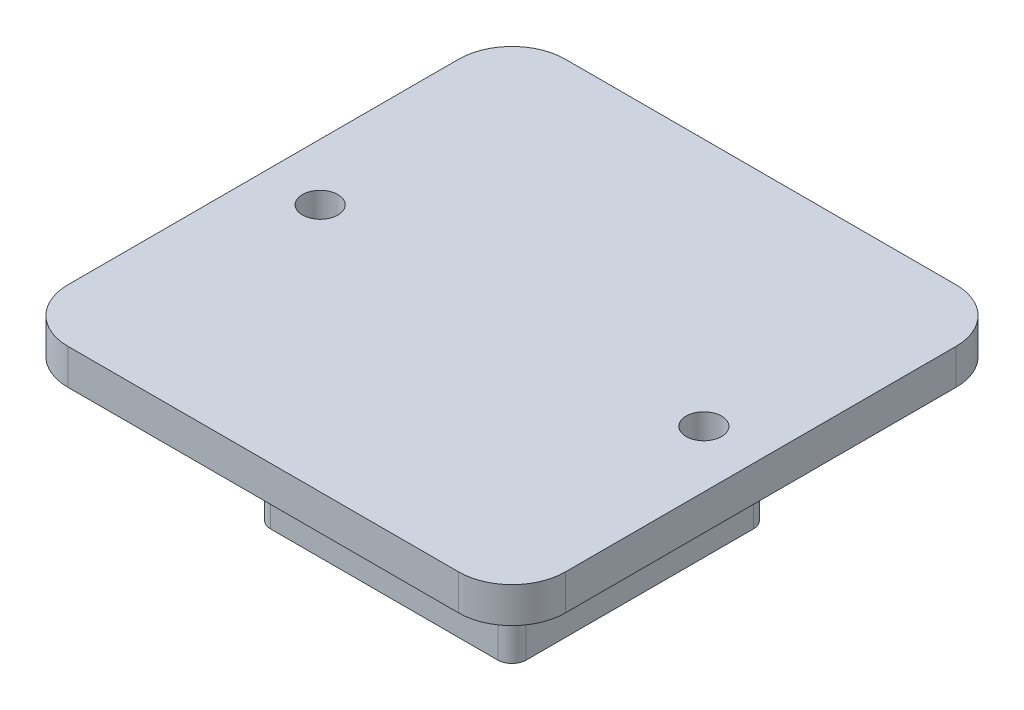
ISO-10303-21;
HEADER;
FILE_DESCRIPTION(('STEP AP214'),'2;1');
FILE_NAME('part.step','',(''),(''),'','','');
FILE_SCHEMA(('AUTOMOTIVE_DESIGN { 1 0 10303 214 1 1 1 1 }'));
ENDSEC;
DATA;
#1=APPLICATION_CONTEXT('core data for automotive mechanical design processes');
#2=APPLICATION_PROTOCOL_DEFINITION('international standard','automotive_design',2000,#1);
#3=PRODUCT_CONTEXT('',#1,'mechanical');
#4=PRODUCT('Part','Part','',(#3));
#5=PRODUCT_RELATED_PRODUCT_CATEGORY('part','',(#4));
#6=PRODUCT_DEFINITION_FORMATION('','',#4);
#7=PRODUCT_DEFINITION_CONTEXT('part definition',#1,'design');
#8=PRODUCT_DEFINITION('design','',#6,#7);
#9=PRODUCT_DEFINITION_SHAPE('','',#8);
#10=(LENGTH_UNIT() NAMED_UNIT(*) SI_UNIT(.MILLI.,.METRE.));
#11=(NAMED_UNIT(*) PLANE_ANGLE_UNIT() SI_UNIT($,.RADIAN.));
#12=(NAMED_UNIT(*) SI_UNIT($,.STERADIAN.) SOLID_ANGLE_UNIT());
#13=UNCERTAINTY_MEASURE_WITH_UNIT(LENGTH_MEASURE(1.E-05),#10,'distance_accuracy_value','');
#14=(GEOMETRIC_REPRESENTATION_CONTEXT(3) GLOBAL_UNCERTAINTY_ASSIGNED_CONTEXT((#13)) GLOBAL_UNIT_ASSIGNED_CONTEXT((#10,
#11,#12)) REPRESENTATION_CONTEXT('',''));
#15=CARTESIAN_POINT('',(0.,0.,0.));
#16=DIRECTION('',(0.,0.,1.));
#17=DIRECTION('',(1.,0.,0.));
#18=AXIS2_PLACEMENT_3D('',#15,#16,#17);
#19=CARTESIAN_POINT('',(0.,0.,0.));
#20=DIRECTION('',(0.,-1.,0.));
#21=DIRECTION('',(0.,0.,-1.));
#22=AXIS2_PLACEMENT_3D('',#19,#20,#21);
#23=PLANE('',#22);
#24=DIRECTION('',(-1.,0.,0.));
#25=VECTOR('',#24,1.);
#26=CARTESIAN_POINT('',(-18.,0.,-18.));
#27=LINE('',#26,#25);
#28=CARTESIAN_POINT('',(16.,0.,-18.));
#29=VERTEX_POINT('',#28);
#30=CARTESIAN_POINT('',(-16.,0.,-18.));
#31=VERTEX_POINT('',#30);
#32=EDGE_CURVE('E237',#29,#31,#27,.T.);
#33=ORIENTED_EDGE('',*,*,#32,.F.);
#34=CARTESIAN_POINT('',(16.,0.,-16.));
#35=DIRECTION('',(0.,-1.,0.));
#36=DIRECTION('',(0.,0.,-1.));
#37=AXIS2_PLACEMENT_3D('',#34,#35,#36);
#38=CIRCLE('',#37,2.);
#39=CARTESIAN_POINT('',(18.,0.,-16.));
#40=VERTEX_POINT('',#39);
#41=EDGE_CURVE('E332',#29,#40,#38,.T.);
#42=ORIENTED_EDGE('',*,*,#41,.T.);
#43=DIRECTION('',(0.,0.,-1.));
#44=VECTOR('',#43,1.);
#45=CARTESIAN_POINT('',(18.,0.,18.));
#46=LINE('',#45,#44);
#47=CARTESIAN_POINT('',(18.,0.,16.));
#48=VERTEX_POINT('',#47);
#49=EDGE_CURVE('E231',#48,#40,#46,.T.);
#50=ORIENTED_EDGE('',*,*,#49,.F.);
#51=CARTESIAN_POINT('',(16.,0.,16.));
#52=DIRECTION('',(0.,-1.,0.));
#53=DIRECTION('',(0.,0.,-1.));
#54=AXIS2_PLACEMENT_3D('',#51,#52,#53);
#55=CIRCLE('',#54,2.);
#56=CARTESIAN_POINT('',(16.,0.,18.));
#57=VERTEX_POINT('',#56);
#58=EDGE_CURVE('E329',#48,#57,#55,.T.);
#59=ORIENTED_EDGE('',*,*,#58,.T.);
#60=DIRECTION('',(1.,0.,0.));
#61=VECTOR('',#60,1.);
#62=CARTESIAN_POINT('',(-18.,0.,18.));
#63=LINE('',#62,#61);
#64=CARTESIAN_POINT('',(-16.,0.,18.));
#65=VERTEX_POINT('',#64);
#66=EDGE_CURVE('E250',#65,#57,#63,.T.);
#67=ORIENTED_EDGE('',*,*,#66,.F.);
#68=CARTESIAN_POINT('',(-16.,0.,16.));
#69=DIRECTION('',(0.,-1.,0.));
#70=DIRECTION('',(0.,0.,-1.));
#71=AXIS2_PLACEMENT_3D('',#68,#69,#70);
#72=CIRCLE('',#71,2.);
#73=CARTESIAN_POINT('',(-18.,0.,16.));
#74=VERTEX_POINT('',#73);
#75=EDGE_CURVE('E323',#65,#74,#72,.T.);
#76=ORIENTED_EDGE('',*,*,#75,.T.);
#77=DIRECTION('',(0.,0.,1.));
#78=VECTOR('',#77,1.);
#79=CARTESIAN_POINT('',(-18.,0.,18.));
#80=LINE('',#79,#78);
#81=CARTESIAN_POINT('',(-18.,0.,-16.));
#82=VERTEX_POINT('',#81);
#83=EDGE_CURVE('E246',#82,#74,#80,.T.);
#84=ORIENTED_EDGE('',*,*,#83,.F.);
#85=CARTESIAN_POINT('',(-16.,0.,-16.));
#86=DIRECTION('',(0.,-1.,0.));
#87=DIRECTION('',(0.,0.,-1.));
#88=AXIS2_PLACEMENT_3D('',#85,#86,#87);
#89=CIRCLE('',#88,2.);
#90=EDGE_CURVE('E326',#82,#31,#89,.T.);
#91=ORIENTED_EDGE('',*,*,#90,.T.);
#92=EDGE_LOOP('',(#33,#42,#50,#59,#67,#76,#84,#91));
#93=FACE_BOUND('',#92,.T.);
#94=DIRECTION('',(1.,0.,0.));
#95=VECTOR('',#94,1.);
#96=CARTESIAN_POINT('',(-15.01,0.,15.01));
#97=LINE('',#96,#95);
#98=CARTESIAN_POINT('',(-15.01,0.,15.01));
#99=VERTEX_POINT('',#98);
#100=CARTESIAN_POINT('',(15.01,0.,15.01));
#101=VERTEX_POINT('',#100);
#102=EDGE_CURVE('E225',#99,#101,#97,.T.);
#103=ORIENTED_EDGE('',*,*,#102,.T.);
#104=DIRECTION('',(0.,0.,-1.));
#105=VECTOR('',#104,1.);
#106=CARTESIAN_POINT('',(15.01,0.,15.01));
#107=LINE('',#106,#105);
#108=CARTESIAN_POINT('',(15.01,0.,-15.01));
#109=VERTEX_POINT('',#108);
#110=EDGE_CURVE('E459',#101,#109,#107,.T.);
#111=ORIENTED_EDGE('',*,*,#110,.T.);
#112=DIRECTION('',(-1.,0.,0.));
#113=VECTOR('',#112,1.);
#114=CARTESIAN_POINT('',(-15.01,0.,-15.01));
#115=LINE('',#114,#113);
#116=CARTESIAN_POINT('',(-15.01,0.,-15.01));
#117=VERTEX_POINT('',#116);
#118=EDGE_CURVE('E229',#109,#117,#115,.T.);
#119=ORIENTED_EDGE('',*,*,#118,.T.);
#120=DIRECTION('',(0.,0.,1.));
#121=VECTOR('',#120,1.);
#122=CARTESIAN_POINT('',(-15.01,0.,15.01));
#123=LINE('',#122,#121);
#124=EDGE_CURVE('E483',#117,#99,#123,.T.);
#125=ORIENTED_EDGE('',*,*,#124,.T.);
#126=EDGE_LOOP('',(#103,#111,#119,#125));
#127=FACE_BOUND('',#126,.T.);
#128=ADVANCED_FACE('F41',(#93,#127),#23,.T.);
#129=CARTESIAN_POINT('',(18.,20.,18.));
#130=DIRECTION('',(-1.,0.,0.));
#131=DIRECTION('',(0.,0.,1.));
#132=AXIS2_PLACEMENT_3D('',#129,#130,#131);
#133=PLANE('',#132);
#134=DIRECTION('',(0.,-1.,0.));
#135=VECTOR('',#134,1.);
#136=CARTESIAN_POINT('',(18.,20.,-16.));
#137=LINE('',#136,#135);
#138=CARTESIAN_POINT('',(18.,15.,-16.));
#139=VERTEX_POINT('',#138);
#140=EDGE_CURVE('E338',#40,#139,#137,.F.);
#141=ORIENTED_EDGE('',*,*,#140,.T.);
#142=DIRECTION('',(0.,0.,-1.));
#143=VECTOR('',#142,1.);
#144=CARTESIAN_POINT('',(18.,15.,18.));
#145=LINE('',#144,#143);
#146=CARTESIAN_POINT('',(18.,15.,16.));
#147=VERTEX_POINT('',#146);
#148=EDGE_CURVE('E66',#139,#147,#145,.F.);
#149=ORIENTED_EDGE('',*,*,#148,.T.);
#150=DIRECTION('',(0.,-1.,0.));
#151=VECTOR('',#150,1.);
#152=CARTESIAN_POINT('',(18.,20.,16.));
#153=LINE('',#152,#151);
#154=EDGE_CURVE('E335',#147,#48,#153,.T.);
#155=ORIENTED_EDGE('',*,*,#154,.T.);
#156=ORIENTED_EDGE('',*,*,#49,.T.);
#157=EDGE_LOOP('',(#141,#149,#155,#156));
#158=FACE_BOUND('',#157,.T.);
#159=ADVANCED_FACE('F501',(#158),#133,.F.);
#160=CARTESIAN_POINT('',(-18.,20.,-18.));
#161=DIRECTION('',(0.,0.,1.));
#162=DIRECTION('',(1.,0.,0.));
#163=AXIS2_PLACEMENT_3D('',#160,#161,#162);
#164=PLANE('',#163);
#165=DIRECTION('',(0.,-1.,0.));
#166=VECTOR('',#165,1.);
#167=CARTESIAN_POINT('',(-16.,20.,-18.));
#168=LINE('',#167,#166);
#169=CARTESIAN_POINT('',(-16.,15.,-18.));
#170=VERTEX_POINT('',#169);
#171=EDGE_CURVE('E306',#31,#170,#168,.F.);
#172=ORIENTED_EDGE('',*,*,#171,.T.);
#173=DIRECTION('',(-1.,0.,0.));
#174=VECTOR('',#173,1.);
#175=CARTESIAN_POINT('',(-18.,15.,-18.));
#176=LINE('',#175,#174);
#177=CARTESIAN_POINT('',(16.,15.,-18.));
#178=VERTEX_POINT('',#177);
#179=EDGE_CURVE('E389',#170,#178,#176,.F.);
#180=ORIENTED_EDGE('',*,*,#179,.T.);
#181=DIRECTION('',(0.,-1.,0.));
#182=VECTOR('',#181,1.);
#183=CARTESIAN_POINT('',(16.,20.,-18.));
#184=LINE('',#183,#182);
#185=EDGE_CURVE('E320',#178,#29,#184,.T.);
#186=ORIENTED_EDGE('',*,*,#185,.T.);
#187=ORIENTED_EDGE('',*,*,#32,.T.);
#188=EDGE_LOOP('',(#172,#180,#186,#187));
#189=FACE_BOUND('',#188,.T.);
#190=ADVANCED_FACE('F507',(#189),#164,.F.);
#191=CARTESIAN_POINT('',(-18.,20.,18.));
#192=DIRECTION('',(1.,0.,0.));
#193=DIRECTION('',(0.,0.,-1.));
#194=AXIS2_PLACEMENT_3D('',#191,#192,#193);
#195=PLANE('',#194);
#196=DIRECTION('',(0.,-1.,0.));
#197=VECTOR('',#196,1.);
#198=CARTESIAN_POINT('',(-18.,20.,16.));
#199=LINE('',#198,#197);
#200=CARTESIAN_POINT('',(-18.,15.,16.));
#201=VERTEX_POINT('',#200);
#202=EDGE_CURVE('E347',#74,#201,#199,.F.);
#203=ORIENTED_EDGE('',*,*,#202,.T.);
#204=DIRECTION('',(0.,0.,1.));
#205=VECTOR('',#204,1.);
#206=CARTESIAN_POINT('',(-18.,15.,18.));
#207=LINE('',#206,#205);
#208=CARTESIAN_POINT('',(-18.,15.,-16.));
#209=VERTEX_POINT('',#208);
#210=EDGE_CURVE('E383',#201,#209,#207,.F.);
#211=ORIENTED_EDGE('',*,*,#210,.T.);
#212=DIRECTION('',(0.,-1.,0.));
#213=VECTOR('',#212,1.);
#214=CARTESIAN_POINT('',(-18.,20.,-16.));
#215=LINE('',#214,#213);
#216=EDGE_CURVE('E351',#209,#82,#215,.T.);
#217=ORIENTED_EDGE('',*,*,#216,.T.);
#218=ORIENTED_EDGE('',*,*,#83,.T.);
#219=EDGE_LOOP('',(#203,#211,#217,#218));
#220=FACE_BOUND('',#219,.T.);
#221=ADVANCED_FACE('F516',(#220),#195,.F.);
#222=CARTESIAN_POINT('',(-18.,20.,18.));
#223=DIRECTION('',(0.,0.,-1.));
#224=DIRECTION('',(-1.,0.,0.));
#225=AXIS2_PLACEMENT_3D('',#222,#223,#224);
#226=PLANE('',#225);
#227=DIRECTION('',(0.,-1.,0.));
#228=VECTOR('',#227,1.);
#229=CARTESIAN_POINT('',(16.,20.,18.));
#230=LINE('',#229,#228);
#231=CARTESIAN_POINT('',(16.,15.,18.));
#232=VERTEX_POINT('',#231);
#233=EDGE_CURVE('E344',#57,#232,#230,.F.);
#234=ORIENTED_EDGE('',*,*,#233,.T.);
#235=DIRECTION('',(1.,0.,0.));
#236=VECTOR('',#235,1.);
#237=CARTESIAN_POINT('',(-18.,15.,18.));
#238=LINE('',#237,#236);
#239=CARTESIAN_POINT('',(-16.,15.,18.));
#240=VERTEX_POINT('',#239);
#241=EDGE_CURVE('E11',#232,#240,#238,.F.);
#242=ORIENTED_EDGE('',*,*,#241,.T.);
#243=DIRECTION('',(0.,-1.,0.));
#244=VECTOR('',#243,1.);
#245=CARTESIAN_POINT('',(-16.,20.,18.));
#246=LINE('',#245,#244);
#247=EDGE_CURVE('E341',#240,#65,#246,.T.);
#248=ORIENTED_EDGE('',*,*,#247,.T.);
#249=ORIENTED_EDGE('',*,*,#66,.T.);
#250=EDGE_LOOP('',(#234,#242,#248,#249));
#251=FACE_BOUND('',#250,.T.);
#252=ADVANCED_FACE('F513',(#251),#226,.F.);
#253=CARTESIAN_POINT('',(15.01,20.,15.01));
#254=DIRECTION('',(-1.,0.,0.));
#255=DIRECTION('',(0.,0.,1.));
#256=AXIS2_PLACEMENT_3D('',#253,#254,#255);
#257=PLANE('',#256);
#258=ORIENTED_EDGE('',*,*,#110,.F.);
#259=DIRECTION('',(0.,-1.,0.));
#260=VECTOR('',#259,1.);
#261=CARTESIAN_POINT('',(15.01,20.,15.01));
#262=LINE('',#261,#260);
#263=CARTESIAN_POINT('',(15.01,20.,15.01));
#264=VERTEX_POINT('',#263);
#265=EDGE_CURVE('E223',#264,#101,#262,.T.);
#266=ORIENTED_EDGE('',*,*,#265,.F.);
#267=DIRECTION('',(0.,0.,-1.));
#268=VECTOR('',#267,1.);
#269=CARTESIAN_POINT('',(15.01,20.,15.01));
#270=LINE('',#269,#268);
#271=CARTESIAN_POINT('',(15.01,20.,-15.01));
#272=VERTEX_POINT('',#271);
#273=EDGE_CURVE('E207',#264,#272,#270,.T.);
#274=ORIENTED_EDGE('',*,*,#273,.T.);
#275=DIRECTION('',(0.,-1.,0.));
#276=VECTOR('',#275,1.);
#277=CARTESIAN_POINT('',(15.01,20.,-15.01));
#278=LINE('',#277,#276);
#279=EDGE_CURVE('E220',#272,#109,#278,.T.);
#280=ORIENTED_EDGE('',*,*,#279,.T.);
#281=EDGE_LOOP('',(#258,#266,#274,#280));
#282=FACE_BOUND('',#281,.T.);
#283=ADVANCED_FACE('F219',(#282),#257,.T.);
#284=CARTESIAN_POINT('',(-15.01,20.,-15.01));
#285=DIRECTION('',(0.,0.,1.));
#286=DIRECTION('',(1.,0.,0.));
#287=AXIS2_PLACEMENT_3D('',#284,#285,#286);
#288=PLANE('',#287);
#289=ORIENTED_EDGE('',*,*,#118,.F.);
#290=ORIENTED_EDGE('',*,*,#279,.F.);
#291=DIRECTION('',(-1.,0.,0.));
#292=VECTOR('',#291,1.);
#293=CARTESIAN_POINT('',(-15.01,20.,-15.01));
#294=LINE('',#293,#292);
#295=CARTESIAN_POINT('',(-15.01,20.,-15.01));
#296=VERTEX_POINT('',#295);
#297=EDGE_CURVE('E204',#272,#296,#294,.T.);
#298=ORIENTED_EDGE('',*,*,#297,.T.);
#299=DIRECTION('',(0.,-1.,0.));
#300=VECTOR('',#299,1.);
#301=CARTESIAN_POINT('',(-15.01,20.,-15.01));
#302=LINE('',#301,#300);
#303=EDGE_CURVE('E232',#296,#117,#302,.T.);
#304=ORIENTED_EDGE('',*,*,#303,.T.);
#305=EDGE_LOOP('',(#289,#290,#298,#304));
#306=FACE_BOUND('',#305,.T.);
#307=ADVANCED_FACE('F227',(#306),#288,.T.);
#308=CARTESIAN_POINT('',(-15.01,20.,15.01));
#309=DIRECTION('',(1.,0.,0.));
#310=DIRECTION('',(0.,0.,-1.));
#311=AXIS2_PLACEMENT_3D('',#308,#309,#310);
#312=PLANE('',#311);
#313=ORIENTED_EDGE('',*,*,#124,.F.);
#314=ORIENTED_EDGE('',*,*,#303,.F.);
#315=DIRECTION('',(0.,0.,1.));
#316=VECTOR('',#315,1.);
#317=CARTESIAN_POINT('',(-15.01,20.,15.01));
#318=LINE('',#317,#316);
#319=CARTESIAN_POINT('',(-15.01,20.,15.01));
#320=VERTEX_POINT('',#319);
#321=EDGE_CURVE('E210',#296,#320,#318,.T.);
#322=ORIENTED_EDGE('',*,*,#321,.T.);
#323=DIRECTION('',(0.,-1.,0.));
#324=VECTOR('',#323,1.);
#325=CARTESIAN_POINT('',(-15.01,20.,15.01));
#326=LINE('',#325,#324);
#327=EDGE_CURVE('E239',#320,#99,#326,.T.);
#328=ORIENTED_EDGE('',*,*,#327,.T.);
#329=EDGE_LOOP('',(#313,#314,#322,#328));
#330=FACE_BOUND('',#329,.T.);
#331=ADVANCED_FACE('F496',(#330),#312,.T.);
#332=CARTESIAN_POINT('',(-15.01,20.,15.01));
#333=DIRECTION('',(0.,0.,-1.));
#334=DIRECTION('',(-1.,0.,0.));
#335=AXIS2_PLACEMENT_3D('',#332,#333,#334);
#336=PLANE('',#335);
#337=ORIENTED_EDGE('',*,*,#102,.F.);
#338=ORIENTED_EDGE('',*,*,#327,.F.);
#339=DIRECTION('',(1.,0.,0.));
#340=VECTOR('',#339,1.);
#341=CARTESIAN_POINT('',(-15.01,20.,15.01));
#342=LINE('',#341,#340);
#343=EDGE_CURVE('E476',#320,#264,#342,.T.);
#344=ORIENTED_EDGE('',*,*,#343,.T.);
#345=ORIENTED_EDGE('',*,*,#265,.T.);
#346=EDGE_LOOP('',(#337,#338,#344,#345));
#347=FACE_BOUND('',#346,.T.);
#348=ADVANCED_FACE('F498',(#347),#336,.T.);
#349=CARTESIAN_POINT('',(0.,20.,0.));
#350=DIRECTION('',(0.,-1.,0.));
#351=DIRECTION('',(0.,0.,-1.));
#352=AXIS2_PLACEMENT_3D('',#349,#350,#351);
#353=PLANE('',#352);
#354=ORIENTED_EDGE('',*,*,#273,.F.);
#355=ORIENTED_EDGE('',*,*,#343,.F.);
#356=ORIENTED_EDGE('',*,*,#321,.F.);
#357=ORIENTED_EDGE('',*,*,#297,.F.);
#358=EDGE_LOOP('',(#354,#355,#356,#357));
#359=FACE_BOUND('',#358,.T.);
#360=ADVANCED_FACE('F206',(#359),#353,.T.);
#361=CARTESIAN_POINT('',(35.,25.,35.));
#362=DIRECTION('',(-1.,0.,0.));
#363=DIRECTION('',(0.,0.,1.));
#364=AXIS2_PLACEMENT_3D('',#361,#362,#363);
#365=PLANE('',#364);
#366=DIRECTION('',(0.,0.,-1.));
#367=VECTOR('',#366,1.);
#368=CARTESIAN_POINT('',(35.,20.,35.));
#369=LINE('',#368,#367);
#370=CARTESIAN_POINT('',(35.,20.,27.5));
#371=VERTEX_POINT('',#370);
#372=CARTESIAN_POINT('',(35.,20.,-27.5));
#373=VERTEX_POINT('',#372);
#374=EDGE_CURVE('E316',#371,#373,#369,.T.);
#375=ORIENTED_EDGE('',*,*,#374,.T.);
#376=DIRECTION('',(0.,-1.,0.));
#377=VECTOR('',#376,1.);
#378=CARTESIAN_POINT('',(35.,25.,-27.5));
#379=LINE('',#378,#377);
#380=CARTESIAN_POINT('',(35.,25.,-27.5));
#381=VERTEX_POINT('',#380);
#382=EDGE_CURVE('E277',#373,#381,#379,.F.);
#383=ORIENTED_EDGE('',*,*,#382,.T.);
#384=DIRECTION('',(0.,0.,-1.));
#385=VECTOR('',#384,1.);
#386=CARTESIAN_POINT('',(35.,25.,35.));
#387=LINE('',#386,#385);
#388=CARTESIAN_POINT('',(35.,25.,27.5));
#389=VERTEX_POINT('',#388);
#390=EDGE_CURVE('E442',#389,#381,#387,.T.);
#391=ORIENTED_EDGE('',*,*,#390,.F.);
#392=DIRECTION('',(0.,-1.,0.));
#393=VECTOR('',#392,1.);
#394=CARTESIAN_POINT('',(35.,25.,27.5));
#395=LINE('',#394,#393);
#396=EDGE_CURVE('E273',#389,#371,#395,.T.);
#397=ORIENTED_EDGE('',*,*,#396,.T.);
#398=EDGE_LOOP('',(#375,#383,#391,#397));
#399=FACE_BOUND('',#398,.T.);
#400=ADVANCED_FACE('F654',(#399),#365,.F.);
#401=CARTESIAN_POINT('',(-35.,25.,-35.));
#402=DIRECTION('',(0.,0.,1.));
#403=DIRECTION('',(1.,0.,0.));
#404=AXIS2_PLACEMENT_3D('',#401,#402,#403);
#405=PLANE('',#404);
#406=DIRECTION('',(-1.,0.,0.));
#407=VECTOR('',#406,1.);
#408=CARTESIAN_POINT('',(-35.,25.,-35.));
#409=LINE('',#408,#407);
#410=CARTESIAN_POINT('',(27.5,25.,-35.));
#411=VERTEX_POINT('',#410);
#412=CARTESIAN_POINT('',(-27.5,25.,-35.));
#413=VERTEX_POINT('',#412);
#414=EDGE_CURVE('E446',#411,#413,#409,.T.);
#415=ORIENTED_EDGE('',*,*,#414,.F.);
#416=DIRECTION('',(0.,-1.,0.));
#417=VECTOR('',#416,1.);
#418=CARTESIAN_POINT('',(27.5,25.,-35.));
#419=LINE('',#418,#417);
#420=CARTESIAN_POINT('',(27.5,20.,-35.));
#421=VERTEX_POINT('',#420);
#422=EDGE_CURVE('E257',#411,#421,#419,.T.);
#423=ORIENTED_EDGE('',*,*,#422,.T.);
#424=DIRECTION('',(-1.,0.,0.));
#425=VECTOR('',#424,1.);
#426=CARTESIAN_POINT('',(-35.,20.,-35.));
#427=LINE('',#426,#425);
#428=CARTESIAN_POINT('',(-27.5,20.,-35.));
#429=VERTEX_POINT('',#428);
#430=EDGE_CURVE('E463',#421,#429,#427,.T.);
#431=ORIENTED_EDGE('',*,*,#430,.T.);
#432=DIRECTION('',(0.,-1.,0.));
#433=VECTOR('',#432,1.);
#434=CARTESIAN_POINT('',(-27.5,25.,-35.));
#435=LINE('',#434,#433);
#436=EDGE_CURVE('E254',#429,#413,#435,.F.);
#437=ORIENTED_EDGE('',*,*,#436,.T.);
#438=EDGE_LOOP('',(#415,#423,#431,#437));
#439=FACE_BOUND('',#438,.T.);
#440=ADVANCED_FACE('F633',(#439),#405,.F.);
#441=CARTESIAN_POINT('',(-35.,25.,35.));
#442=DIRECTION('',(1.,0.,0.));
#443=DIRECTION('',(0.,0.,-1.));
#444=AXIS2_PLACEMENT_3D('',#441,#442,#443);
#445=PLANE('',#444);
#446=DIRECTION('',(0.,0.,1.));
#447=VECTOR('',#446,1.);
#448=CARTESIAN_POINT('',(-35.,20.,35.));
#449=LINE('',#448,#447);
#450=CARTESIAN_POINT('',(-35.,20.,-27.5));
#451=VERTEX_POINT('',#450);
#452=CARTESIAN_POINT('',(-35.,20.,27.5));
#453=VERTEX_POINT('',#452);
#454=EDGE_CURVE('E467',#451,#453,#449,.T.);
#455=ORIENTED_EDGE('',*,*,#454,.T.);
#456=DIRECTION('',(0.,-1.,0.));
#457=VECTOR('',#456,1.);
#458=CARTESIAN_POINT('',(-35.,25.,27.5));
#459=LINE('',#458,#457);
#460=CARTESIAN_POINT('',(-35.,25.,27.5));
#461=VERTEX_POINT('',#460);
#462=EDGE_CURVE('E303',#453,#461,#459,.F.);
#463=ORIENTED_EDGE('',*,*,#462,.T.);
#464=DIRECTION('',(0.,0.,1.));
#465=VECTOR('',#464,1.);
#466=CARTESIAN_POINT('',(-35.,25.,35.));
#467=LINE('',#466,#465);
#468=CARTESIAN_POINT('',(-35.,25.,-27.5));
#469=VERTEX_POINT('',#468);
#470=EDGE_CURVE('E451',#469,#461,#467,.T.);
#471=ORIENTED_EDGE('',*,*,#470,.F.);
#472=DIRECTION('',(0.,-1.,0.));
#473=VECTOR('',#472,1.);
#474=CARTESIAN_POINT('',(-35.,25.,-27.5));
#475=LINE('',#474,#473);
#476=EDGE_CURVE('E299',#469,#451,#475,.T.);
#477=ORIENTED_EDGE('',*,*,#476,.T.);
#478=EDGE_LOOP('',(#455,#463,#471,#477));
#479=FACE_BOUND('',#478,.T.);
#480=ADVANCED_FACE('F641',(#479),#445,.F.);
#481=CARTESIAN_POINT('',(-35.,25.,35.));
#482=DIRECTION('',(0.,0.,-1.));
#483=DIRECTION('',(-1.,0.,0.));
#484=AXIS2_PLACEMENT_3D('',#481,#482,#483);
#485=PLANE('',#484);
#486=DIRECTION('',(1.,0.,0.));
#487=VECTOR('',#486,1.);
#488=CARTESIAN_POINT('',(-35.,20.,35.));
#489=LINE('',#488,#487);
#490=CARTESIAN_POINT('',(-27.5,20.,35.));
#491=VERTEX_POINT('',#490);
#492=CARTESIAN_POINT('',(27.5,20.,35.));
#493=VERTEX_POINT('',#492);
#494=EDGE_CURVE('E447',#491,#493,#489,.T.);
#495=ORIENTED_EDGE('',*,*,#494,.T.);
#496=DIRECTION('',(0.,-1.,0.));
#497=VECTOR('',#496,1.);
#498=CARTESIAN_POINT('',(27.5,25.,35.));
#499=LINE('',#498,#497);
#500=CARTESIAN_POINT('',(27.5,25.,35.));
#501=VERTEX_POINT('',#500);
#502=EDGE_CURVE('E296',#493,#501,#499,.F.);
#503=ORIENTED_EDGE('',*,*,#502,.T.);
#504=DIRECTION('',(1.,0.,0.));
#505=VECTOR('',#504,1.);
#506=CARTESIAN_POINT('',(-35.,25.,35.));
#507=LINE('',#506,#505);
#508=CARTESIAN_POINT('',(-27.5,25.,35.));
#509=VERTEX_POINT('',#508);
#510=EDGE_CURVE('E455',#509,#501,#507,.T.);
#511=ORIENTED_EDGE('',*,*,#510,.F.);
#512=DIRECTION('',(0.,-1.,0.));
#513=VECTOR('',#512,1.);
#514=CARTESIAN_POINT('',(-27.5,25.,35.));
#515=LINE('',#514,#513);
#516=EDGE_CURVE('E292',#509,#491,#515,.T.);
#517=ORIENTED_EDGE('',*,*,#516,.T.);
#518=EDGE_LOOP('',(#495,#503,#511,#517));
#519=FACE_BOUND('',#518,.T.);
#520=ADVANCED_FACE('F647',(#519),#485,.F.);
#521=CARTESIAN_POINT('',(0.,25.,0.));
#522=DIRECTION('',(0.,-1.,0.));
#523=DIRECTION('',(0.,0.,-1.));
#524=AXIS2_PLACEMENT_3D('',#521,#522,#523);
#525=PLANE('',#524);
#526=CARTESIAN_POINT('',(-27.,25.,0.));
#527=DIRECTION('',(0.,1.,0.));
#528=DIRECTION('',(0.,0.,1.));
#529=AXIS2_PLACEMENT_3D('',#526,#527,#528);
#530=CIRCLE('',#529,2.5);
#531=CARTESIAN_POINT('',(-27.,25.,2.5));
#532=VERTEX_POINT('',#531);
#533=EDGE_CURVE('E312',#532,#532,#530,.T.);
#534=ORIENTED_EDGE('',*,*,#533,.F.);
#535=EDGE_LOOP('',(#534));
#536=FACE_BOUND('',#535,.T.);
#537=CARTESIAN_POINT('',(27.,25.,0.));
#538=DIRECTION('',(0.,1.,0.));
#539=DIRECTION('',(0.,0.,1.));
#540=AXIS2_PLACEMENT_3D('',#537,#538,#539);
#541=CIRCLE('',#540,2.5);
#542=CARTESIAN_POINT('',(27.,25.,2.49999999999999));
#543=VERTEX_POINT('',#542);
#544=EDGE_CURVE('E428',#543,#543,#541,.T.);
#545=ORIENTED_EDGE('',*,*,#544,.F.);
#546=EDGE_LOOP('',(#545));
#547=FACE_BOUND('',#546,.T.);
#548=ORIENTED_EDGE('',*,*,#390,.T.);
#549=CARTESIAN_POINT('',(27.5,25.,-27.5));
#550=DIRECTION('',(0.,-1.,0.));
#551=DIRECTION('',(0.,0.,-1.));
#552=AXIS2_PLACEMENT_3D('',#549,#550,#551);
#553=CIRCLE('',#552,7.5);
#554=EDGE_CURVE('E289',#381,#411,#553,.F.);
#555=ORIENTED_EDGE('',*,*,#554,.T.);
#556=ORIENTED_EDGE('',*,*,#414,.T.);
#557=CARTESIAN_POINT('',(-27.5,25.,-27.5));
#558=DIRECTION('',(0.,-1.,0.));
#559=DIRECTION('',(0.,0.,-1.));
#560=AXIS2_PLACEMENT_3D('',#557,#558,#559);
#561=CIRCLE('',#560,7.5);
#562=EDGE_CURVE('E280',#413,#469,#561,.F.);
#563=ORIENTED_EDGE('',*,*,#562,.T.);
#564=ORIENTED_EDGE('',*,*,#470,.T.);
#565=CARTESIAN_POINT('',(-27.5,25.,27.5));
#566=DIRECTION('',(0.,-1.,0.));
#567=DIRECTION('',(0.,0.,-1.));
#568=AXIS2_PLACEMENT_3D('',#565,#566,#567);
#569=CIRCLE('',#568,7.5);
#570=EDGE_CURVE('E283',#461,#509,#569,.F.);
#571=ORIENTED_EDGE('',*,*,#570,.T.);
#572=ORIENTED_EDGE('',*,*,#510,.T.);
#573=CARTESIAN_POINT('',(27.5,25.,27.5));
#574=DIRECTION('',(0.,-1.,0.));
#575=DIRECTION('',(0.,0.,-1.));
#576=AXIS2_PLACEMENT_3D('',#573,#574,#575);
#577=CIRCLE('',#576,7.5);
#578=EDGE_CURVE('E286',#501,#389,#577,.F.);
#579=ORIENTED_EDGE('',*,*,#578,.T.);
#580=EDGE_LOOP('',(#548,#555,#556,#563,#564,#571,#572,#579));
#581=FACE_BOUND('',#580,.T.);
#582=ADVANCED_FACE('F621',(#536,#547,#581),#525,.F.);
#583=DIRECTION('',(0.,0.,1.));
#584=VECTOR('',#583,1.);
#585=CARTESIAN_POINT('',(-23.,20.,0.));
#586=LINE('',#585,#584);
#587=CARTESIAN_POINT('',(-23.,20.,-16.));
#588=VERTEX_POINT('',#587);
#589=CARTESIAN_POINT('',(-23.,20.,16.));
#590=VERTEX_POINT('',#589);
#591=EDGE_CURVE('E372',#588,#590,#586,.T.);
#592=ORIENTED_EDGE('',*,*,#591,.T.);
#593=CARTESIAN_POINT('',(-16.,20.,16.));
#594=DIRECTION('',(0.,-1.,0.));
#595=DIRECTION('',(0.,0.,-1.));
#596=AXIS2_PLACEMENT_3D('',#593,#594,#595);
#597=CIRCLE('',#596,7.);
#598=CARTESIAN_POINT('',(-16.,20.,23.));
#599=VERTEX_POINT('',#598);
#600=EDGE_CURVE('E375',#590,#599,#597,.F.);
#601=ORIENTED_EDGE('',*,*,#600,.T.);
#602=DIRECTION('',(1.,0.,0.));
#603=VECTOR('',#602,1.);
#604=CARTESIAN_POINT('',(0.,20.,23.));
#605=LINE('',#604,#603);
#606=CARTESIAN_POINT('',(16.,20.,23.));
#607=VERTEX_POINT('',#606);
#608=EDGE_CURVE('E354',#599,#607,#605,.T.);
#609=ORIENTED_EDGE('',*,*,#608,.T.);
#610=CARTESIAN_POINT('',(16.,20.,16.));
#611=DIRECTION('',(0.,-1.,0.));
#612=DIRECTION('',(0.,0.,-1.));
#613=AXIS2_PLACEMENT_3D('',#610,#611,#612);
#614=CIRCLE('',#613,7.);
#615=CARTESIAN_POINT('',(23.,20.,16.));
#616=VERTEX_POINT('',#615);
#617=EDGE_CURVE('E357',#607,#616,#614,.F.);
#618=ORIENTED_EDGE('',*,*,#617,.T.);
#619=DIRECTION('',(0.,0.,-1.));
#620=VECTOR('',#619,1.);
#621=CARTESIAN_POINT('',(23.,20.,0.));
#622=LINE('',#621,#620);
#623=CARTESIAN_POINT('',(23.,20.,-16.));
#624=VERTEX_POINT('',#623);
#625=EDGE_CURVE('E360',#616,#624,#622,.T.);
#626=ORIENTED_EDGE('',*,*,#625,.T.);
#627=CARTESIAN_POINT('',(16.,20.,-16.));
#628=DIRECTION('',(0.,-1.,0.));
#629=DIRECTION('',(0.,0.,-1.));
#630=AXIS2_PLACEMENT_3D('',#627,#628,#629);
#631=CIRCLE('',#630,7.);
#632=CARTESIAN_POINT('',(16.,20.,-23.));
#633=VERTEX_POINT('',#632);
#634=EDGE_CURVE('E363',#624,#633,#631,.F.);
#635=ORIENTED_EDGE('',*,*,#634,.T.);
#636=DIRECTION('',(-1.,0.,0.));
#637=VECTOR('',#636,1.);
#638=CARTESIAN_POINT('',(0.,20.,-23.));
#639=LINE('',#638,#637);
#640=CARTESIAN_POINT('',(-16.,20.,-23.));
#641=VERTEX_POINT('',#640);
#642=EDGE_CURVE('E366',#633,#641,#639,.T.);
#643=ORIENTED_EDGE('',*,*,#642,.T.);
#644=CARTESIAN_POINT('',(-16.,20.,-16.));
#645=DIRECTION('',(0.,-1.,0.));
#646=DIRECTION('',(0.,0.,-1.));
#647=AXIS2_PLACEMENT_3D('',#644,#645,#646);
#648=CIRCLE('',#647,7.);
#649=EDGE_CURVE('E369',#641,#588,#648,.F.);
#650=ORIENTED_EDGE('',*,*,#649,.T.);
#651=EDGE_LOOP('',(#592,#601,#609,#618,#626,#635,#643,#650));
#652=FACE_BOUND('',#651,.T.);
#653=CARTESIAN_POINT('',(-27.,20.,0.));
#654=DIRECTION('',(0.,-1.,0.));
#655=DIRECTION('',(0.,0.,-1.));
#656=AXIS2_PLACEMENT_3D('',#653,#654,#655);
#657=CIRCLE('',#656,2.5);
#658=CARTESIAN_POINT('',(-27.,20.,-2.5));
#659=VERTEX_POINT('',#658);
#660=EDGE_CURVE('E311',#659,#659,#657,.T.);
#661=ORIENTED_EDGE('',*,*,#660,.F.);
#662=EDGE_LOOP('',(#661));
#663=FACE_BOUND('',#662,.T.);
#664=CARTESIAN_POINT('',(27.,20.,0.));
#665=DIRECTION('',(0.,-1.,0.));
#666=DIRECTION('',(0.,0.,-1.));
#667=AXIS2_PLACEMENT_3D('',#664,#665,#666);
#668=CIRCLE('',#667,2.5);
#669=CARTESIAN_POINT('',(27.,20.,-2.50000000000001));
#670=VERTEX_POINT('',#669);
#671=EDGE_CURVE('E307',#670,#670,#668,.T.);
#672=ORIENTED_EDGE('',*,*,#671,.F.);
#673=EDGE_LOOP('',(#672));
#674=FACE_BOUND('',#673,.T.);
#675=ORIENTED_EDGE('',*,*,#430,.F.);
#676=CARTESIAN_POINT('',(27.5,20.,-27.5));
#677=DIRECTION('',(0.,-1.,0.));
#678=DIRECTION('',(0.,0.,-1.));
#679=AXIS2_PLACEMENT_3D('',#676,#677,#678);
#680=CIRCLE('',#679,7.5);
#681=EDGE_CURVE('E270',#421,#373,#680,.T.);
#682=ORIENTED_EDGE('',*,*,#681,.T.);
#683=ORIENTED_EDGE('',*,*,#374,.F.);
#684=CARTESIAN_POINT('',(27.5,20.,27.5));
#685=DIRECTION('',(0.,-1.,0.));
#686=DIRECTION('',(0.,0.,-1.));
#687=AXIS2_PLACEMENT_3D('',#684,#685,#686);
#688=CIRCLE('',#687,7.5);
#689=EDGE_CURVE('E267',#371,#493,#688,.T.);
#690=ORIENTED_EDGE('',*,*,#689,.T.);
#691=ORIENTED_EDGE('',*,*,#494,.F.);
#692=CARTESIAN_POINT('',(-27.5,20.,27.5));
#693=DIRECTION('',(0.,-1.,0.));
#694=DIRECTION('',(0.,0.,-1.));
#695=AXIS2_PLACEMENT_3D('',#692,#693,#694);
#696=CIRCLE('',#695,7.5);
#697=EDGE_CURVE('E264',#491,#453,#696,.T.);
#698=ORIENTED_EDGE('',*,*,#697,.T.);
#699=ORIENTED_EDGE('',*,*,#454,.F.);
#700=CARTESIAN_POINT('',(-27.5,20.,-27.5));
#701=DIRECTION('',(0.,-1.,0.));
#702=DIRECTION('',(0.,0.,-1.));
#703=AXIS2_PLACEMENT_3D('',#700,#701,#702);
#704=CIRCLE('',#703,7.5);
#705=EDGE_CURVE('E261',#451,#429,#704,.T.);
#706=ORIENTED_EDGE('',*,*,#705,.T.);
#707=EDGE_LOOP('',(#675,#682,#683,#690,#691,#698,#699,#706));
#708=FACE_BOUND('',#707,.T.);
#709=ADVANCED_FACE('F528',(#652,#663,#674,#708),#353,.T.);
#710=CARTESIAN_POINT('',(27.5,25.,-27.5));
#711=DIRECTION('',(0.,-1.,0.));
#712=DIRECTION('',(0.,0.,-1.));
#713=AXIS2_PLACEMENT_3D('',#710,#711,#712);
#714=CYLINDRICAL_SURFACE('',#713,7.5);
#715=ORIENTED_EDGE('',*,*,#554,.F.);
#716=ORIENTED_EDGE('',*,*,#382,.F.);
#717=ORIENTED_EDGE('',*,*,#681,.F.);
#718=ORIENTED_EDGE('',*,*,#422,.F.);
#719=EDGE_LOOP('',(#715,#716,#717,#718));
#720=FACE_BOUND('',#719,.T.);
#721=ADVANCED_FACE('F524',(#720),#714,.T.);
#722=CARTESIAN_POINT('',(27.5,25.,27.5));
#723=DIRECTION('',(0.,-1.,0.));
#724=DIRECTION('',(0.,0.,-1.));
#725=AXIS2_PLACEMENT_3D('',#722,#723,#724);
#726=CYLINDRICAL_SURFACE('',#725,7.5);
#727=ORIENTED_EDGE('',*,*,#578,.F.);
#728=ORIENTED_EDGE('',*,*,#502,.F.);
#729=ORIENTED_EDGE('',*,*,#689,.F.);
#730=ORIENTED_EDGE('',*,*,#396,.F.);
#731=EDGE_LOOP('',(#727,#728,#729,#730));
#732=FACE_BOUND('',#731,.T.);
#733=ADVANCED_FACE('F527',(#732),#726,.T.);
#734=CARTESIAN_POINT('',(-27.5,25.,27.5));
#735=DIRECTION('',(0.,-1.,0.));
#736=DIRECTION('',(0.,0.,-1.));
#737=AXIS2_PLACEMENT_3D('',#734,#735,#736);
#738=CYLINDRICAL_SURFACE('',#737,7.5);
#739=ORIENTED_EDGE('',*,*,#570,.F.);
#740=ORIENTED_EDGE('',*,*,#462,.F.);
#741=ORIENTED_EDGE('',*,*,#697,.F.);
#742=ORIENTED_EDGE('',*,*,#516,.F.);
#743=EDGE_LOOP('',(#739,#740,#741,#742));
#744=FACE_BOUND('',#743,.T.);
#745=ADVANCED_FACE('F532',(#744),#738,.T.);
#746=CARTESIAN_POINT('',(-27.5,25.,-27.5));
#747=DIRECTION('',(0.,-1.,0.));
#748=DIRECTION('',(0.,0.,-1.));
#749=AXIS2_PLACEMENT_3D('',#746,#747,#748);
#750=CYLINDRICAL_SURFACE('',#749,7.5);
#751=ORIENTED_EDGE('',*,*,#562,.F.);
#752=ORIENTED_EDGE('',*,*,#436,.F.);
#753=ORIENTED_EDGE('',*,*,#705,.F.);
#754=ORIENTED_EDGE('',*,*,#476,.F.);
#755=EDGE_LOOP('',(#751,#752,#753,#754));
#756=FACE_BOUND('',#755,.T.);
#757=ADVANCED_FACE('F536',(#756),#750,.T.);
#758=CARTESIAN_POINT('',(27.,0.,0.));
#759=DIRECTION('',(0.,1.,0.));
#760=DIRECTION('',(0.,0.,1.));
#761=AXIS2_PLACEMENT_3D('',#758,#759,#760);
#762=CYLINDRICAL_SURFACE('',#761,2.5);
#763=ORIENTED_EDGE('',*,*,#671,.T.);
#764=EDGE_LOOP('',(#763));
#765=FACE_BOUND('',#764,.T.);
#766=ORIENTED_EDGE('',*,*,#544,.T.);
#767=EDGE_LOOP('',(#766));
#768=FACE_BOUND('',#767,.T.);
#769=ADVANCED_FACE('F540',(#765,#768),#762,.F.);
#770=CARTESIAN_POINT('',(-27.,0.,0.));
#771=DIRECTION('',(0.,1.,0.));
#772=DIRECTION('',(0.,0.,1.));
#773=AXIS2_PLACEMENT_3D('',#770,#771,#772);
#774=CYLINDRICAL_SURFACE('',#773,2.5);
#775=ORIENTED_EDGE('',*,*,#660,.T.);
#776=EDGE_LOOP('',(#775));
#777=FACE_BOUND('',#776,.T.);
#778=ORIENTED_EDGE('',*,*,#533,.T.);
#779=EDGE_LOOP('',(#778));
#780=FACE_BOUND('',#779,.T.);
#781=ADVANCED_FACE('F546',(#777,#780),#774,.F.);
#782=CARTESIAN_POINT('',(16.,20.,-16.));
#783=DIRECTION('',(0.,-1.,0.));
#784=DIRECTION('',(0.,0.,-1.));
#785=AXIS2_PLACEMENT_3D('',#782,#783,#784);
#786=CYLINDRICAL_SURFACE('',#785,2.);
#787=ORIENTED_EDGE('',*,*,#185,.F.);
#788=CARTESIAN_POINT('',(16.,15.,-16.));
#789=DIRECTION('',(0.,-1.,0.));
#790=DIRECTION('',(0.,0.,-1.));
#791=AXIS2_PLACEMENT_3D('',#788,#789,#790);
#792=CIRCLE('',#791,2.);
#793=EDGE_CURVE('E392',#178,#139,#792,.T.);
#794=ORIENTED_EDGE('',*,*,#793,.T.);
#795=ORIENTED_EDGE('',*,*,#140,.F.);
#796=ORIENTED_EDGE('',*,*,#41,.F.);
#797=EDGE_LOOP('',(#787,#794,#795,#796));
#798=FACE_BOUND('',#797,.T.);
#799=ADVANCED_FACE('F542',(#798),#786,.T.);
#800=CARTESIAN_POINT('',(16.,20.,16.));
#801=DIRECTION('',(0.,-1.,0.));
#802=DIRECTION('',(0.,0.,-1.));
#803=AXIS2_PLACEMENT_3D('',#800,#801,#802);
#804=CYLINDRICAL_SURFACE('',#803,2.);
#805=ORIENTED_EDGE('',*,*,#154,.F.);
#806=CARTESIAN_POINT('',(16.,15.,16.));
#807=DIRECTION('',(0.,-1.,0.));
#808=DIRECTION('',(0.,0.,-1.));
#809=AXIS2_PLACEMENT_3D('',#806,#807,#808);
#810=CIRCLE('',#809,2.);
#811=EDGE_CURVE('E51',#147,#232,#810,.T.);
#812=ORIENTED_EDGE('',*,*,#811,.T.);
#813=ORIENTED_EDGE('',*,*,#233,.F.);
#814=ORIENTED_EDGE('',*,*,#58,.F.);
#815=EDGE_LOOP('',(#805,#812,#813,#814));
#816=FACE_BOUND('',#815,.T.);
#817=ADVANCED_FACE('F545',(#816),#804,.T.);
#818=CARTESIAN_POINT('',(-16.,20.,-16.));
#819=DIRECTION('',(0.,-1.,0.));
#820=DIRECTION('',(0.,0.,-1.));
#821=AXIS2_PLACEMENT_3D('',#818,#819,#820);
#822=CYLINDRICAL_SURFACE('',#821,2.);
#823=ORIENTED_EDGE('',*,*,#216,.F.);
#824=CARTESIAN_POINT('',(-16.,15.,-16.));
#825=DIRECTION('',(0.,-1.,0.));
#826=DIRECTION('',(0.,0.,-1.));
#827=AXIS2_PLACEMENT_3D('',#824,#825,#826);
#828=CIRCLE('',#827,2.);
#829=EDGE_CURVE('E386',#209,#170,#828,.T.);
#830=ORIENTED_EDGE('',*,*,#829,.T.);
#831=ORIENTED_EDGE('',*,*,#171,.F.);
#832=ORIENTED_EDGE('',*,*,#90,.F.);
#833=EDGE_LOOP('',(#823,#830,#831,#832));
#834=FACE_BOUND('',#833,.T.);
#835=ADVANCED_FACE('F550',(#834),#822,.T.);
#836=CARTESIAN_POINT('',(-16.,20.,16.));
#837=DIRECTION('',(0.,-1.,0.));
#838=DIRECTION('',(0.,0.,-1.));
#839=AXIS2_PLACEMENT_3D('',#836,#837,#838);
#840=CYLINDRICAL_SURFACE('',#839,2.);
#841=ORIENTED_EDGE('',*,*,#247,.F.);
#842=CARTESIAN_POINT('',(-16.,15.,16.));
#843=DIRECTION('',(0.,-1.,0.));
#844=DIRECTION('',(0.,0.,-1.));
#845=AXIS2_PLACEMENT_3D('',#842,#843,#844);
#846=CIRCLE('',#845,2.);
#847=EDGE_CURVE('E379',#240,#201,#846,.T.);
#848=ORIENTED_EDGE('',*,*,#847,.T.);
#849=ORIENTED_EDGE('',*,*,#202,.F.);
#850=ORIENTED_EDGE('',*,*,#75,.F.);
#851=EDGE_LOOP('',(#841,#848,#849,#850));
#852=FACE_BOUND('',#851,.T.);
#853=ADVANCED_FACE('F553',(#852),#840,.T.);
#854=CARTESIAN_POINT('',(16.,15.,-16.));
#855=DIRECTION('',(0.,-1.,0.));
#856=DIRECTION('',(0.,0.,-1.));
#857=AXIS2_PLACEMENT_3D('',#854,#855,#856);
#858=TOROIDAL_SURFACE('',#857,7.,5.);
#859=CARTESIAN_POINT('',(23.,15.,-16.));
#860=DIRECTION('',(0.,0.,-1.));
#861=DIRECTION('',(-1.,0.,0.));
#862=AXIS2_PLACEMENT_3D('',#859,#860,#861);
#863=CIRCLE('',#862,5.);
#864=EDGE_CURVE('E420',#139,#624,#863,.T.);
#865=ORIENTED_EDGE('',*,*,#864,.F.);
#866=ORIENTED_EDGE('',*,*,#793,.F.);
#867=CARTESIAN_POINT('',(16.,15.,-23.));
#868=DIRECTION('',(1.,0.,0.));
#869=DIRECTION('',(0.,0.,-1.));
#870=AXIS2_PLACEMENT_3D('',#867,#868,#869);
#871=CIRCLE('',#870,5.);
#872=EDGE_CURVE('E45',#633,#178,#871,.T.);
#873=ORIENTED_EDGE('',*,*,#872,.F.);
#874=ORIENTED_EDGE('',*,*,#634,.F.);
#875=EDGE_LOOP('',(#865,#866,#873,#874));
#876=FACE_BOUND('',#875,.T.);
#877=ADVANCED_FACE('F43',(#876),#858,.F.);
#878=CARTESIAN_POINT('',(0.,15.,-23.));
#879=DIRECTION('',(-1.,0.,0.));
#880=DIRECTION('',(0.,0.,1.));
#881=AXIS2_PLACEMENT_3D('',#878,#879,#880);
#882=CYLINDRICAL_SURFACE('',#881,5.);
#883=ORIENTED_EDGE('',*,*,#872,.T.);
#884=ORIENTED_EDGE('',*,*,#179,.F.);
#885=CARTESIAN_POINT('',(-16.,15.,-23.));
#886=DIRECTION('',(1.,0.,0.));
#887=DIRECTION('',(0.,0.,-1.));
#888=AXIS2_PLACEMENT_3D('',#885,#886,#887);
#889=CIRCLE('',#888,5.);
#890=EDGE_CURVE('E417',#641,#170,#889,.T.);
#891=ORIENTED_EDGE('',*,*,#890,.F.);
#892=ORIENTED_EDGE('',*,*,#642,.F.);
#893=EDGE_LOOP('',(#883,#884,#891,#892));
#894=FACE_BOUND('',#893,.T.);
#895=ADVANCED_FACE('F580',(#894),#882,.F.);
#896=CARTESIAN_POINT('',(23.,15.,0.));
#897=DIRECTION('',(0.,0.,-1.));
#898=DIRECTION('',(-1.,0.,0.));
#899=AXIS2_PLACEMENT_3D('',#896,#897,#898);
#900=CYLINDRICAL_SURFACE('',#899,5.);
#901=ORIENTED_EDGE('',*,*,#864,.T.);
#902=ORIENTED_EDGE('',*,*,#625,.F.);
#903=CARTESIAN_POINT('',(23.,15.,16.));
#904=DIRECTION('',(0.,0.,-1.));
#905=DIRECTION('',(-1.,0.,0.));
#906=AXIS2_PLACEMENT_3D('',#903,#904,#905);
#907=CIRCLE('',#906,5.);
#908=EDGE_CURVE('E413',#147,#616,#907,.T.);
#909=ORIENTED_EDGE('',*,*,#908,.F.);
#910=ORIENTED_EDGE('',*,*,#148,.F.);
#911=EDGE_LOOP('',(#901,#902,#909,#910));
#912=FACE_BOUND('',#911,.T.);
#913=ADVANCED_FACE('F577',(#912),#900,.F.);
#914=CARTESIAN_POINT('',(-16.,15.,-16.));
#915=DIRECTION('',(0.,-1.,0.));
#916=DIRECTION('',(0.,0.,-1.));
#917=AXIS2_PLACEMENT_3D('',#914,#915,#916);
#918=TOROIDAL_SURFACE('',#917,7.,5.);
#919=ORIENTED_EDGE('',*,*,#890,.T.);
#920=ORIENTED_EDGE('',*,*,#829,.F.);
#921=CARTESIAN_POINT('',(-23.,15.,-16.));
#922=DIRECTION('',(0.,0.,-1.));
#923=DIRECTION('',(-1.,0.,0.));
#924=AXIS2_PLACEMENT_3D('',#921,#922,#923);
#925=CIRCLE('',#924,5.);
#926=EDGE_CURVE('E409',#588,#209,#925,.T.);
#927=ORIENTED_EDGE('',*,*,#926,.F.);
#928=ORIENTED_EDGE('',*,*,#649,.F.);
#929=EDGE_LOOP('',(#919,#920,#927,#928));
#930=FACE_BOUND('',#929,.T.);
#931=ADVANCED_FACE('F573',(#930),#918,.F.);
#932=CARTESIAN_POINT('',(16.,15.,16.));
#933=DIRECTION('',(0.,-1.,0.));
#934=DIRECTION('',(0.,0.,-1.));
#935=AXIS2_PLACEMENT_3D('',#932,#933,#934);
#936=TOROIDAL_SURFACE('',#935,7.,5.);
#937=ORIENTED_EDGE('',*,*,#908,.T.);
#938=ORIENTED_EDGE('',*,*,#617,.F.);
#939=CARTESIAN_POINT('',(16.,15.,23.));
#940=DIRECTION('',(1.,0.,0.));
#941=DIRECTION('',(0.,0.,-1.));
#942=AXIS2_PLACEMENT_3D('',#939,#940,#941);
#943=CIRCLE('',#942,5.);
#944=EDGE_CURVE('E405',#232,#607,#943,.T.);
#945=ORIENTED_EDGE('',*,*,#944,.F.);
#946=ORIENTED_EDGE('',*,*,#811,.F.);
#947=EDGE_LOOP('',(#937,#938,#945,#946));
#948=FACE_BOUND('',#947,.T.);
#949=ADVANCED_FACE('F569',(#948),#936,.F.);
#950=CARTESIAN_POINT('',(-23.,15.,0.));
#951=DIRECTION('',(0.,0.,1.));
#952=DIRECTION('',(1.,0.,0.));
#953=AXIS2_PLACEMENT_3D('',#950,#951,#952);
#954=CYLINDRICAL_SURFACE('',#953,5.);
#955=ORIENTED_EDGE('',*,*,#926,.T.);
#956=ORIENTED_EDGE('',*,*,#210,.F.);
#957=CARTESIAN_POINT('',(-23.,15.,16.));
#958=DIRECTION('',(0.,0.,-1.));
#959=DIRECTION('',(-1.,0.,0.));
#960=AXIS2_PLACEMENT_3D('',#957,#958,#959);
#961=CIRCLE('',#960,5.);
#962=EDGE_CURVE('E402',#590,#201,#961,.T.);
#963=ORIENTED_EDGE('',*,*,#962,.F.);
#964=ORIENTED_EDGE('',*,*,#591,.F.);
#965=EDGE_LOOP('',(#955,#956,#963,#964));
#966=FACE_BOUND('',#965,.T.);
#967=ADVANCED_FACE('F565',(#966),#954,.F.);
#968=CARTESIAN_POINT('',(0.,15.,23.));
#969=DIRECTION('',(1.,0.,0.));
#970=DIRECTION('',(0.,0.,-1.));
#971=AXIS2_PLACEMENT_3D('',#968,#969,#970);
#972=CYLINDRICAL_SURFACE('',#971,5.);
#973=ORIENTED_EDGE('',*,*,#944,.T.);
#974=ORIENTED_EDGE('',*,*,#608,.F.);
#975=CARTESIAN_POINT('',(-16.,15.,23.));
#976=DIRECTION('',(1.,0.,0.));
#977=DIRECTION('',(0.,0.,-1.));
#978=AXIS2_PLACEMENT_3D('',#975,#976,#977);
#979=CIRCLE('',#978,5.);
#980=EDGE_CURVE('E399',#240,#599,#979,.T.);
#981=ORIENTED_EDGE('',*,*,#980,.F.);
#982=ORIENTED_EDGE('',*,*,#241,.F.);
#983=EDGE_LOOP('',(#973,#974,#981,#982));
#984=FACE_BOUND('',#983,.T.);
#985=ADVANCED_FACE('F561',(#984),#972,.F.);
#986=CARTESIAN_POINT('',(-16.,15.,16.));
#987=DIRECTION('',(0.,-1.,0.));
#988=DIRECTION('',(0.,0.,-1.));
#989=AXIS2_PLACEMENT_3D('',#986,#987,#988);
#990=TOROIDAL_SURFACE('',#989,7.,5.);
#991=ORIENTED_EDGE('',*,*,#962,.T.);
#992=ORIENTED_EDGE('',*,*,#847,.F.);
#993=ORIENTED_EDGE('',*,*,#980,.T.);
#994=ORIENTED_EDGE('',*,*,#600,.F.);
#995=EDGE_LOOP('',(#991,#992,#993,#994));
#996=FACE_BOUND('',#995,.T.);
#997=ADVANCED_FACE('F558',(#996),#990,.F.);
#998=CLOSED_SHELL('',(#128,#159,#190,#221,#252,#283,#307,#331,#348,#360,#400,#440,#480,#520,
#582,#709,#721,#733,#745,#757,#769,#781,#799,#817,#835,#853,#877,#895,#913,#931,#949,#967,#985,#997));
#999=MANIFOLD_SOLID_BREP('B2',#998);
#1000=ADVANCED_BREP_SHAPE_REPRESENTATION('',(#18,#999),#14);
#1001=SHAPE_DEFINITION_REPRESENTATION(#9,#1000);
ENDSEC;
END-ISO-10303-21;
